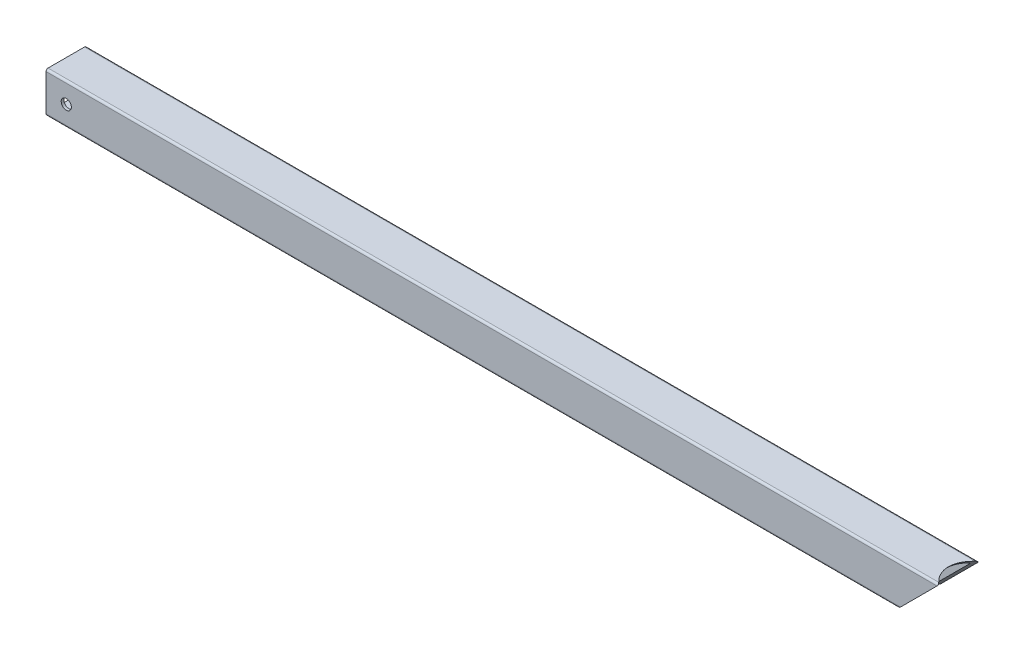
ISO-10303-21;
HEADER;
FILE_DESCRIPTION(('STEP AP214'),'2;1');
FILE_NAME('part.step','',(''),(''),'','','');
FILE_SCHEMA(('AUTOMOTIVE_DESIGN { 1 0 10303 214 1 1 1 1 }'));
ENDSEC;
DATA;
#1=APPLICATION_CONTEXT('core data for automotive mechanical design processes');
#2=APPLICATION_PROTOCOL_DEFINITION('international standard','automotive_design',2000,#1);
#3=PRODUCT_CONTEXT('',#1,'mechanical');
#4=PRODUCT('Part','Part','',(#3));
#5=PRODUCT_RELATED_PRODUCT_CATEGORY('part','',(#4));
#6=PRODUCT_DEFINITION_FORMATION('','',#4);
#7=PRODUCT_DEFINITION_CONTEXT('part definition',#1,'design');
#8=PRODUCT_DEFINITION('design','',#6,#7);
#9=PRODUCT_DEFINITION_SHAPE('','',#8);
#10=(LENGTH_UNIT() NAMED_UNIT(*) SI_UNIT(.MILLI.,.METRE.));
#11=(NAMED_UNIT(*) PLANE_ANGLE_UNIT() SI_UNIT($,.RADIAN.));
#12=(NAMED_UNIT(*) SI_UNIT($,.STERADIAN.) SOLID_ANGLE_UNIT());
#13=UNCERTAINTY_MEASURE_WITH_UNIT(LENGTH_MEASURE(1.E-05),#10,'distance_accuracy_value','');
#14=(GEOMETRIC_REPRESENTATION_CONTEXT(3) GLOBAL_UNCERTAINTY_ASSIGNED_CONTEXT((#13)) GLOBAL_UNIT_ASSIGNED_CONTEXT((#10,
#11,#12)) REPRESENTATION_CONTEXT('',''));
#15=CARTESIAN_POINT('',(0.,0.,0.));
#16=DIRECTION('',(0.,0.,1.));
#17=DIRECTION('',(1.,0.,0.));
#18=AXIS2_PLACEMENT_3D('',#15,#16,#17);
#19=CARTESIAN_POINT('',(279.4,-11.43,-11.43));
#20=DIRECTION('',(-1.,0.,0.));
#21=DIRECTION('',(0.,0.,1.));
#22=AXIS2_PLACEMENT_3D('',#19,#20,#21);
#23=CYLINDRICAL_SURFACE('',#22,1.27);
#24=DIRECTION('',(-1.,0.,0.));
#25=VECTOR('',#24,1.);
#26=CARTESIAN_POINT('',(279.4,-11.43,-12.7));
#27=LINE('',#26,#25);
#28=CARTESIAN_POINT('',(255.919803674975,-11.43,-12.7));
#29=VERTEX_POINT('',#28);
#30=CARTESIAN_POINT('',(-279.4,-11.43,-12.7));
#31=VERTEX_POINT('',#30);
#32=EDGE_CURVE('E49',#29,#31,#27,.T.);
#33=ORIENTED_EDGE('',*,*,#32,.F.);
#34=CARTESIAN_POINT('',(255.919803674975,-11.43,-12.7));
#35=CARTESIAN_POINT('',(255.894957543847,-11.4548417258395,-12.6999962194759));
#36=CARTESIAN_POINT('',(255.869664440707,-11.4792176894659,-12.6992714877463));
#37=CARTESIAN_POINT('',(255.818328055955,-11.5270652930461,-12.6965126686545));
#38=CARTESIAN_POINT('',(255.792285160453,-11.5505373843964,-12.6944792440858));
#39=CARTESIAN_POINT('',(255.713344918863,-11.6195565014448,-12.6866268969872));
#40=CARTESIAN_POINT('',(255.659506355722,-11.6638342299887,-12.6790545017476));
#41=CARTESIAN_POINT('',(255.550178828134,-11.7491797873484,-12.6600129649216));
#42=CARTESIAN_POINT('',(255.494692476709,-11.7902523590301,-12.6485497207063));
#43=CARTESIAN_POINT('',(255.382431099538,-11.8695425997091,-12.6222443449281));
#44=CARTESIAN_POINT('',(255.325654927251,-11.9077575878537,-12.6073990920606));
#45=CARTESIAN_POINT('',(255.175383750814,-12.0045811082829,-12.564489227567));
#46=CARTESIAN_POINT('',(255.081157210331,-12.060976282312,-12.5339676130855));
#47=CARTESIAN_POINT('',(254.891487526311,-12.1671615714709,-12.4660788379171));
#48=CARTESIAN_POINT('',(254.796044185256,-12.2169505989048,-12.4287105523377));
#49=CARTESIAN_POINT('',(254.604429632076,-12.3102786709045,-12.347521843794));
#50=CARTESIAN_POINT('',(254.508257078328,-12.3537977433952,-12.3036816658039));
#51=CARTESIAN_POINT('',(254.316193005717,-12.4342949750355,-12.2098171908621));
#52=CARTESIAN_POINT('',(254.22030146175,-12.4712737371003,-12.1597934646606));
#53=CARTESIAN_POINT('',(254.04211214204,-12.5338171415608,-12.0604469337267));
#54=CARTESIAN_POINT('',(253.959685207277,-12.5602433296724,-12.0118972387238));
#55=CARTESIAN_POINT('',(253.796306888049,-12.6072003476257,-11.9098483388045));
#56=CARTESIAN_POINT('',(253.715353963868,-12.627737704168,-11.8563547010172));
#57=CARTESIAN_POINT('',(253.595855353771,-12.653367463873,-11.7722322717811));
#58=CARTESIAN_POINT('',(253.556432620308,-12.6610362824116,-11.7436146065397));
#59=CARTESIAN_POINT('',(253.47831687986,-12.6745018760352,-11.6849896726999));
#60=CARTESIAN_POINT('',(253.439623679518,-12.6802991539137,-11.6549827798017));
#61=CARTESIAN_POINT('',(253.363019114384,-12.6898312459334,-11.5934054292642));
#62=CARTESIAN_POINT('',(253.325110723037,-12.6935592475362,-11.5618301755331));
#63=CARTESIAN_POINT('',(253.250442758106,-12.6986381948937,-11.4971072604059));
#64=CARTESIAN_POINT('',(253.213684220514,-12.6999870544288,-11.4639582451375));
#65=CARTESIAN_POINT('',(253.177652126478,-12.7,-11.4299999999999));
#66=B_SPLINE_CURVE_WITH_KNOTS('',3,(#34,#35,#36,#37,#38,#39,#40,#41,#42,#43,#44,#45,#46,#47,#48,
#49,#50,#51,#52,#53,#54,#55,#56,#57,#58,#59,#60,#61,#62,#63,#64,#65),.UNSPECIFIED.,.F.,.F.,(4,2,
2,2,2,2,2,2,2,2,2,2,2,2,2,4),(0.,0.105369631536978,0.210685940076655,0.420774442968652,
0.630545925644212,0.840511799428038,1.18194827595703,1.5234409000998,1.86599832860088,
2.20852416213175,2.50600075065606,2.80314635462638,2.95104139317471,3.09889666626283,
3.24723586902615,3.39570508276573),.UNSPECIFIED.);
#67=CARTESIAN_POINT('',(253.177652126478,-12.7,-11.43));
#68=VERTEX_POINT('',#67);
#69=EDGE_CURVE('E217',#29,#68,#66,.T.);
#70=ORIENTED_EDGE('',*,*,#69,.T.);
#71=DIRECTION('',(-1.,0.,0.));
#72=VECTOR('',#71,1.);
#73=CARTESIAN_POINT('',(279.4,-12.7,-11.43));
#74=LINE('',#73,#72);
#75=CARTESIAN_POINT('',(-279.4,-12.7,-11.43));
#76=VERTEX_POINT('',#75);
#77=EDGE_CURVE('E188',#68,#76,#74,.T.);
#78=ORIENTED_EDGE('',*,*,#77,.T.);
#79=CARTESIAN_POINT('',(-279.4,-11.43,-11.43));
#80=DIRECTION('',(1.,0.,0.));
#81=DIRECTION('',(0.,0.,-1.));
#82=AXIS2_PLACEMENT_3D('',#79,#80,#81);
#83=CIRCLE('',#82,1.27);
#84=EDGE_CURVE('E247',#76,#31,#83,.T.);
#85=ORIENTED_EDGE('',*,*,#84,.T.);
#86=EDGE_LOOP('',(#33,#70,#78,#85));
#87=FACE_BOUND('',#86,.T.);
#88=ADVANCED_FACE('F41',(#87),#23,.T.);
#89=CARTESIAN_POINT('',(279.4,-11.43,-12.7));
#90=DIRECTION('',(0.,0.,1.));
#91=DIRECTION('',(1.,0.,0.));
#92=AXIS2_PLACEMENT_3D('',#89,#90,#91);
#93=PLANE('',#92);
#94=CARTESIAN_POINT('',(-266.7,0.,-12.7));
#95=DIRECTION('',(0.,0.,1.));
#96=DIRECTION('',(1.,0.,0.));
#97=AXIS2_PLACEMENT_3D('',#94,#95,#96);
#98=CIRCLE('',#97,3.17500000000009);
#99=CARTESIAN_POINT('',(-263.525,0.,-12.7));
#100=VERTEX_POINT('',#99);
#101=EDGE_CURVE('E205',#100,#100,#98,.T.);
#102=ORIENTED_EDGE('',*,*,#101,.T.);
#103=EDGE_LOOP('',(#102));
#104=FACE_BOUND('',#103,.T.);
#105=DIRECTION('',(-1.,0.,0.));
#106=VECTOR('',#105,1.);
#107=CARTESIAN_POINT('',(279.4,11.43,-12.7));
#108=LINE('',#107,#106);
#109=CARTESIAN_POINT('',(278.779803674975,11.43,-12.7));
#110=VERTEX_POINT('',#109);
#111=CARTESIAN_POINT('',(-279.4,11.43,-12.7));
#112=VERTEX_POINT('',#111);
#113=EDGE_CURVE('E200',#110,#112,#108,.T.);
#114=ORIENTED_EDGE('',*,*,#113,.F.);
#115=DIRECTION('',(0.707106781186546,0.707106781186549,0.));
#116=VECTOR('',#115,1.);
#117=CARTESIAN_POINT('',(-12.3750981625116,-279.724901837487,-12.7));
#118=LINE('',#117,#116);
#119=EDGE_CURVE('E284',#110,#29,#118,.F.);
#120=ORIENTED_EDGE('',*,*,#119,.T.);
#121=ORIENTED_EDGE('',*,*,#32,.T.);
#122=DIRECTION('',(0.,1.,0.));
#123=VECTOR('',#122,1.);
#124=CARTESIAN_POINT('',(-279.4,-11.43,-12.7));
#125=LINE('',#124,#123);
#126=EDGE_CURVE('E250',#31,#112,#125,.T.);
#127=ORIENTED_EDGE('',*,*,#126,.T.);
#128=EDGE_LOOP('',(#114,#120,#121,#127));
#129=FACE_BOUND('',#128,.T.);
#130=ADVANCED_FACE('F370',(#104,#129),#93,.F.);
#131=CARTESIAN_POINT('',(279.4,11.43,-11.43));
#132=DIRECTION('',(-1.,0.,0.));
#133=DIRECTION('',(0.,0.,1.));
#134=AXIS2_PLACEMENT_3D('',#131,#132,#133);
#135=CYLINDRICAL_SURFACE('',#134,1.27);
#136=DIRECTION('',(-1.,0.,0.));
#137=VECTOR('',#136,1.);
#138=CARTESIAN_POINT('',(279.4,12.7,-11.43));
#139=LINE('',#138,#137);
#140=CARTESIAN_POINT('',(278.577652126478,12.7,-11.43));
#141=VERTEX_POINT('',#140);
#142=CARTESIAN_POINT('',(-279.4,12.7,-11.43));
#143=VERTEX_POINT('',#142);
#144=EDGE_CURVE('E198',#141,#143,#139,.T.);
#145=ORIENTED_EDGE('',*,*,#144,.F.);
#146=CARTESIAN_POINT('',(278.577652126478,12.7,-11.43));
#147=CARTESIAN_POINT('',(278.616420180411,12.6999846321577,-11.4665654233653));
#148=CARTESIAN_POINT('',(278.654625926407,12.6984191591043,-11.5037878516088));
#149=CARTESIAN_POINT('',(278.729638826816,12.6917344998643,-11.5796458047302));
#150=CARTESIAN_POINT('',(278.766438577498,12.6865986732247,-11.6182871406798));
#151=CARTESIAN_POINT('',(278.838580906175,12.6721942762635,-11.6973817501484));
#152=CARTESIAN_POINT('',(278.873889616776,12.6628592030363,-11.7378543611719));
#153=CARTESIAN_POINT('',(278.941604926433,12.6394677261573,-11.8197409236704));
#154=CARTESIAN_POINT('',(278.974017473802,12.6254212950463,-11.8611527159754));
#155=CARTESIAN_POINT('',(279.03377304588,12.5926018118235,-11.9429502866958));
#156=CARTESIAN_POINT('',(279.061269038032,12.5740451968597,-11.9833089070582));
#157=CARTESIAN_POINT('',(279.111432017148,12.5313905698115,-12.0639645466447));
#158=CARTESIAN_POINT('',(279.134114216106,12.5073105297732,-12.104261347995));
#159=CARTESIAN_POINT('',(279.173455377153,12.4527270250248,-12.184529268501));
#160=CARTESIAN_POINT('',(279.190023245852,12.4221363520972,-12.2244874185047));
#161=CARTESIAN_POINT('',(279.214788932091,12.3548858739465,-12.3018336315258));
#162=CARTESIAN_POINT('',(279.223001377331,12.3182368063112,-12.3392260788423));
#163=CARTESIAN_POINT('',(279.229276109864,12.2457051248077,-12.4044505337627));
#164=CARTESIAN_POINT('',(279.228630875635,12.2104735423866,-12.4328836956778));
#165=CARTESIAN_POINT('',(279.220194234608,12.1377441190686,-12.4854671472502));
#166=CARTESIAN_POINT('',(279.212401993488,12.1002460140613,-12.509616936485));
#167=CARTESIAN_POINT('',(279.191521733575,12.0284294049004,-12.5508562368796));
#168=CARTESIAN_POINT('',(279.17907436298,11.9941895678329,-12.5684204467489));
#169=CARTESIAN_POINT('',(279.149807494104,11.92588675925,-12.5997905881081));
#170=CARTESIAN_POINT('',(279.132986745302,11.8918238411688,-12.6135954423342));
#171=CARTESIAN_POINT('',(279.084498426514,11.8039519642779,-12.6450612503211));
#172=CARTESIAN_POINT('',(279.050018701105,11.7507164284584,-12.6599712047168));
#173=CARTESIAN_POINT('',(278.974765470416,11.6471821398172,-12.6824198236611));
#174=CARTESIAN_POINT('',(278.933973248081,11.5968927546258,-12.6899360611251));
#175=CARTESIAN_POINT('',(278.873155752986,11.5279268002356,-12.6963825552937));
#176=CARTESIAN_POINT('',(278.854860667167,11.5078850348342,-12.6977639273686));
#177=CARTESIAN_POINT('',(278.817733702223,11.4684747706071,-12.6995693992476));
#178=CARTESIAN_POINT('',(278.798905473958,11.4491030872709,-12.6999989064917));
#179=CARTESIAN_POINT('',(278.779803674975,11.4300000000002,-12.7000000000002));
#180=B_SPLINE_CURVE_WITH_KNOTS('',3,(#146,#147,#148,#149,#150,#151,#152,#153,#154,#155,#156,
#157,#158,#159,#160,#161,#162,#163,#164,#165,#166,#167,#168,#169,#170,#171,#172,#173,#174,#175,
#176,#177,#178,#179),.UNSPECIFIED.,.F.,.F.,(4,2,2,2,2,2,2,2,2,2,2,2,2,2,2,2,4),(0.,
0.159908153118587,0.320566635718767,0.483864263693132,0.646818397947911,0.803118211504047,
0.958916497266179,1.11695023554792,1.27470682827218,1.40972318443091,1.5447553040504,
1.66563472843038,1.78654875510036,1.98090693195935,2.17585284687349,2.25734573523925,
2.33837447172254),.UNSPECIFIED.);
#181=EDGE_CURVE('E285',#141,#110,#180,.T.);
#182=ORIENTED_EDGE('',*,*,#181,.T.);
#183=ORIENTED_EDGE('',*,*,#113,.T.);
#184=CARTESIAN_POINT('',(-279.4,11.43,-11.43));
#185=DIRECTION('',(1.,0.,0.));
#186=DIRECTION('',(0.,0.,-1.));
#187=AXIS2_PLACEMENT_3D('',#184,#185,#186);
#188=CIRCLE('',#187,1.27);
#189=EDGE_CURVE('E253',#112,#143,#188,.T.);
#190=ORIENTED_EDGE('',*,*,#189,.T.);
#191=EDGE_LOOP('',(#145,#182,#183,#190));
#192=FACE_BOUND('',#191,.T.);
#193=ADVANCED_FACE('F298',(#192),#135,.T.);
#194=CARTESIAN_POINT('',(279.4,12.7,-11.43));
#195=DIRECTION('',(0.,-1.,0.));
#196=DIRECTION('',(0.,0.,-1.));
#197=AXIS2_PLACEMENT_3D('',#194,#195,#196);
#198=PLANE('',#197);
#199=DIRECTION('',(-1.,0.,0.));
#200=VECTOR('',#199,1.);
#201=CARTESIAN_POINT('',(279.4,12.7,11.43));
#202=LINE('',#201,#200);
#203=CARTESIAN_POINT('',(278.577652126478,12.7,11.43));
#204=VERTEX_POINT('',#203);
#205=CARTESIAN_POINT('',(-279.4,12.7,11.43));
#206=VERTEX_POINT('',#205);
#207=EDGE_CURVE('E196',#204,#206,#202,.T.);
#208=ORIENTED_EDGE('',*,*,#207,.F.);
#209=CARTESIAN_POINT('',(300.130266817044,12.7,0.));
#210=DIRECTION('',(0.,-1.,0.));
#211=DIRECTION('',(1.,0.,0.));
#212=AXIS2_PLACEMENT_3D('',#209,#210,#211);
#213=ELLIPSE('',#212,26.9407683632074,19.05);
#214=EDGE_CURVE('E289',#204,#141,#213,.T.);
#215=ORIENTED_EDGE('',*,*,#214,.T.);
#216=ORIENTED_EDGE('',*,*,#144,.T.);
#217=DIRECTION('',(0.,0.,1.));
#218=VECTOR('',#217,1.);
#219=CARTESIAN_POINT('',(-279.4,12.7,-11.43));
#220=LINE('',#219,#218);
#221=EDGE_CURVE('E256',#143,#206,#220,.T.);
#222=ORIENTED_EDGE('',*,*,#221,.T.);
#223=EDGE_LOOP('',(#208,#215,#216,#222));
#224=FACE_BOUND('',#223,.T.);
#225=ADVANCED_FACE('F363',(#224),#198,.F.);
#226=CARTESIAN_POINT('',(279.4,11.43,11.43));
#227=DIRECTION('',(-1.,0.,0.));
#228=DIRECTION('',(0.,0.,1.));
#229=AXIS2_PLACEMENT_3D('',#226,#227,#228);
#230=CYLINDRICAL_SURFACE('',#229,1.27);
#231=DIRECTION('',(-1.,0.,0.));
#232=VECTOR('',#231,1.);
#233=CARTESIAN_POINT('',(279.4,11.43,12.7));
#234=LINE('',#233,#232);
#235=CARTESIAN_POINT('',(278.779803674975,11.43,12.7));
#236=VERTEX_POINT('',#235);
#237=CARTESIAN_POINT('',(-279.4,11.43,12.7));
#238=VERTEX_POINT('',#237);
#239=EDGE_CURVE('E194',#236,#238,#234,.T.);
#240=ORIENTED_EDGE('',*,*,#239,.F.);
#241=CARTESIAN_POINT('',(278.779803674975,11.43,12.7));
#242=CARTESIAN_POINT('',(278.804444362603,11.4546480084071,12.6999939638767));
#243=CARTESIAN_POINT('',(278.82863190141,11.4797362083523,12.6992823272284));
#244=CARTESIAN_POINT('',(278.875954336379,11.5308965841626,12.6962471606912));
#245=CARTESIAN_POINT('',(278.899086671782,11.5569708992045,12.6939199110048));
#246=CARTESIAN_POINT('',(278.967124564795,11.637379382943,12.68412836582));
#247=CARTESIAN_POINT('',(279.009985879419,11.6932282083046,12.6738428451918));
#248=CARTESIAN_POINT('',(279.075773257981,11.791160556714,12.6482804993879));
#249=CARTESIAN_POINT('',(279.100842759709,11.8324180649487,12.6353864613769));
#250=CARTESIAN_POINT('',(279.14527882576,11.915790984173,12.6042531765812));
#251=CARTESIAN_POINT('',(279.16467372316,11.9579009701733,12.5860414253625));
#252=CARTESIAN_POINT('',(279.193717108424,12.0349751465982,12.5473376800479));
#253=CARTESIAN_POINT('',(279.204448002064,12.069967322891,12.5277234064691));
#254=CARTESIAN_POINT('',(279.220193951898,12.1388355944765,12.4845615866853));
#255=CARTESIAN_POINT('',(279.225208762388,12.1727116417321,12.461013871453));
#256=CARTESIAN_POINT('',(279.229166370706,12.2382563744188,12.4104776686741));
#257=CARTESIAN_POINT('',(279.228100327614,12.2699217781182,12.3834842271353));
#258=CARTESIAN_POINT('',(279.220099417013,12.3300596592717,12.3269385893725));
#259=CARTESIAN_POINT('',(279.213161891738,12.3585306841579,12.2973852398281));
#260=CARTESIAN_POINT('',(279.194226190004,12.4113988157248,12.2370607875753));
#261=CARTESIAN_POINT('',(279.182292904979,12.4358427502721,12.2063097301285));
#262=CARTESIAN_POINT('',(279.154231598695,12.480971855613,12.1440303912843));
#263=CARTESIAN_POINT('',(279.138103639397,12.5016570819201,12.1125021213736));
#264=CARTESIAN_POINT('',(279.091002474962,12.551580652597,12.0288528074961));
#265=CARTESIAN_POINT('',(279.057152484468,12.5777644708162,11.9765280364669));
#266=CARTESIAN_POINT('',(278.983117882197,12.6217402367498,11.8725715311363));
#267=CARTESIAN_POINT('',(278.94289726187,12.6394820356141,11.8209456658597));
#268=CARTESIAN_POINT('',(278.850862337502,12.6701795889949,11.7105008041841));
#269=CARTESIAN_POINT('',(278.798245653844,12.6817784169615,11.651980502399));
#270=CARTESIAN_POINT('',(278.716869698192,12.6929423893217,11.5666796992762));
#271=CARTESIAN_POINT('',(278.689543380427,12.6956271771959,11.5388530691607));
#272=CARTESIAN_POINT('',(278.634136982983,12.6991527944397,11.4839059658847));
#273=CARTESIAN_POINT('',(278.606057849447,12.6999958378029,11.4567846836284));
#274=CARTESIAN_POINT('',(278.577652126478,12.7,11.43));
#275=B_SPLINE_CURVE_WITH_KNOTS('',3,(#241,#242,#243,#244,#245,#246,#247,#248,#249,#250,#251,
#252,#253,#254,#255,#256,#257,#258,#259,#260,#261,#262,#263,#264,#265,#266,#267,#268,#269,#270,
#271,#272,#273,#274),.UNSPECIFIED.,.F.,.F.,(4,2,2,2,2,2,2,2,2,2,2,2,2,2,2,2,4),(0.,
0.104517300331745,0.209276043519903,0.421650486139639,0.571081911823154,0.719753976005541,
0.843793698348452,0.96783875228178,1.09206420053156,1.21634591035024,1.33906105752559,
1.46177439213892,1.66340528347579,1.86621943192861,2.10408229523501,2.22131969384218,
2.33841608157691),.UNSPECIFIED.);
#276=EDGE_CURVE('E350',#236,#204,#275,.T.);
#277=ORIENTED_EDGE('',*,*,#276,.T.);
#278=ORIENTED_EDGE('',*,*,#207,.T.);
#279=CARTESIAN_POINT('',(-279.4,11.43,11.43));
#280=DIRECTION('',(1.,0.,0.));
#281=DIRECTION('',(0.,0.,-1.));
#282=AXIS2_PLACEMENT_3D('',#279,#280,#281);
#283=CIRCLE('',#282,1.27);
#284=EDGE_CURVE('E259',#206,#238,#283,.T.);
#285=ORIENTED_EDGE('',*,*,#284,.T.);
#286=EDGE_LOOP('',(#240,#277,#278,#285));
#287=FACE_BOUND('',#286,.T.);
#288=ADVANCED_FACE('F358',(#287),#230,.T.);
#289=CARTESIAN_POINT('',(279.4,-11.43,12.7));
#290=DIRECTION('',(0.,0.,-1.));
#291=DIRECTION('',(-1.,0.,0.));
#292=AXIS2_PLACEMENT_3D('',#289,#290,#291);
#293=PLANE('',#292);
#294=CARTESIAN_POINT('',(-266.7,0.,12.7));
#295=DIRECTION('',(0.,0.,1.));
#296=DIRECTION('',(1.,0.,0.));
#297=AXIS2_PLACEMENT_3D('',#294,#295,#296);
#298=CIRCLE('',#297,3.17500000000009);
#299=CARTESIAN_POINT('',(-263.525,0.,12.7));
#300=VERTEX_POINT('',#299);
#301=EDGE_CURVE('E212',#300,#300,#298,.T.);
#302=ORIENTED_EDGE('',*,*,#301,.F.);
#303=EDGE_LOOP('',(#302));
#304=FACE_BOUND('',#303,.T.);
#305=DIRECTION('',(-1.,0.,0.));
#306=VECTOR('',#305,1.);
#307=CARTESIAN_POINT('',(279.4,-11.43,12.7));
#308=LINE('',#307,#306);
#309=CARTESIAN_POINT('',(255.919803674975,-11.43,12.7));
#310=VERTEX_POINT('',#309);
#311=CARTESIAN_POINT('',(-279.4,-11.43,12.7));
#312=VERTEX_POINT('',#311);
#313=EDGE_CURVE('E192',#310,#312,#308,.T.);
#314=ORIENTED_EDGE('',*,*,#313,.F.);
#315=DIRECTION('',(0.707106781186546,0.707106781186549,0.));
#316=VECTOR('',#315,1.);
#317=CARTESIAN_POINT('',(-12.3750981625116,-279.724901837487,12.7));
#318=LINE('',#317,#316);
#319=EDGE_CURVE('E357',#310,#236,#318,.T.);
#320=ORIENTED_EDGE('',*,*,#319,.T.);
#321=ORIENTED_EDGE('',*,*,#239,.T.);
#322=DIRECTION('',(0.,-1.,0.));
#323=VECTOR('',#322,1.);
#324=CARTESIAN_POINT('',(-279.4,-11.43,12.7));
#325=LINE('',#324,#323);
#326=EDGE_CURVE('E262',#238,#312,#325,.T.);
#327=ORIENTED_EDGE('',*,*,#326,.T.);
#328=EDGE_LOOP('',(#314,#320,#321,#327));
#329=FACE_BOUND('',#328,.T.);
#330=ADVANCED_FACE('F362',(#304,#329),#293,.F.);
#331=CARTESIAN_POINT('',(279.4,-11.43,11.43));
#332=DIRECTION('',(-1.,0.,0.));
#333=DIRECTION('',(0.,0.,1.));
#334=AXIS2_PLACEMENT_3D('',#331,#332,#333);
#335=CYLINDRICAL_SURFACE('',#334,1.27);
#336=DIRECTION('',(-1.,0.,0.));
#337=VECTOR('',#336,1.);
#338=CARTESIAN_POINT('',(279.4,-12.7,11.43));
#339=LINE('',#338,#337);
#340=CARTESIAN_POINT('',(253.177652126478,-12.7,11.43));
#341=VERTEX_POINT('',#340);
#342=CARTESIAN_POINT('',(-279.4,-12.7,11.43));
#343=VERTEX_POINT('',#342);
#344=EDGE_CURVE('E190',#341,#343,#339,.T.);
#345=ORIENTED_EDGE('',*,*,#344,.F.);
#346=CARTESIAN_POINT('',(253.177652126478,-12.7,11.43));
#347=CARTESIAN_POINT('',(253.205104793447,-12.6999959154023,11.4558784785728));
#348=CARTESIAN_POINT('',(253.232984285976,-12.6992094063169,11.4812849787559));
#349=CARTESIAN_POINT('',(253.289458175372,-12.6962106257014,11.5311789842798));
#350=CARTESIAN_POINT('',(253.318052236947,-12.6939990112205,11.55566690763));
#351=CARTESIAN_POINT('',(253.404600060034,-12.685447291348,11.6277113453743));
#352=CARTESIAN_POINT('',(253.463450655592,-12.6771889628395,11.6739707137514));
#353=CARTESIAN_POINT('',(253.582882682347,-12.6563396077054,11.7633129359902));
#354=CARTESIAN_POINT('',(253.643466722037,-12.643741698336,11.8063906109524));
#355=CARTESIAN_POINT('',(253.765843595806,-12.6147615654862,11.8895412616229));
#356=CARTESIAN_POINT('',(253.827637426448,-12.5983760906549,11.9296116163904));
#357=CARTESIAN_POINT('',(253.986718501894,-12.55214338598,12.028428424659));
#358=CARTESIAN_POINT('',(254.084582674398,-12.5198846183341,12.0851289957576));
#359=CARTESIAN_POINT('',(254.2812280029,-12.4480968681711,12.1919151290621));
#360=CARTESIAN_POINT('',(254.38000929725,-12.4085667712457,12.2419996752675));
#361=CARTESIAN_POINT('',(254.577740360337,-12.3226222000374,12.335630038794));
#362=CARTESIAN_POINT('',(254.676690186553,-12.2762044882759,12.3791727616981));
#363=CARTESIAN_POINT('',(254.873918477183,-12.1765335846637,12.4594089097371));
#364=CARTESIAN_POINT('',(254.972197095657,-12.1232820209887,12.4961039612463));
#365=CARTESIAN_POINT('',(255.144468623298,-12.0228324849519,12.5542715388771));
#366=CARTESIAN_POINT('',(255.218796263503,-11.9771048660253,12.5772997806269));
#367=CARTESIAN_POINT('',(255.365854616045,-11.8811698067722,12.6183045676409));
#368=CARTESIAN_POINT('',(255.438587203529,-11.8309680218012,12.6362873742907));
#369=CARTESIAN_POINT('',(255.54585132871,-11.7519933064939,12.658806764282));
#370=CARTESIAN_POINT('',(255.581287073258,-11.725067368271,12.6655690260273));
#371=CARTESIAN_POINT('',(255.651406616922,-11.6699176131027,12.6774515276572));
#372=CARTESIAN_POINT('',(255.686090623327,-11.6416941608163,12.6825722257072));
#373=CARTESIAN_POINT('',(255.754654634073,-11.5837683722331,12.6909983744161));
#374=CARTESIAN_POINT('',(255.788531310221,-11.5540610967744,12.6942972514603));
#375=CARTESIAN_POINT('',(255.855117990631,-11.4931594337706,12.6987934427146));
#376=CARTESIAN_POINT('',(255.887826891666,-11.461963701811,12.6999888186119));
#377=CARTESIAN_POINT('',(255.919803674975,-11.43,12.7));
#378=B_SPLINE_CURVE_WITH_KNOTS('',3,(#346,#347,#348,#349,#350,#351,#352,#353,#354,#355,#356,
#357,#358,#359,#360,#361,#362,#363,#364,#365,#366,#367,#368,#369,#370,#371,#372,#373,#374,#375,
#376,#377),.UNSPECIFIED.,.F.,.F.,(4,2,2,2,2,2,2,2,2,2,2,2,2,2,2,4),(0.,0.113147336203438,
0.226242542779318,0.451897166197312,0.677911347164117,0.904120270247521,1.25647276878089,
1.60887931413885,1.96145203373239,2.31394090773599,2.5844905605703,2.85470296099514,
2.98970617826235,3.12467168283961,3.26012104898458,3.3956951624006),.UNSPECIFIED.);
#379=EDGE_CURVE('E56',#341,#310,#378,.T.);
#380=ORIENTED_EDGE('',*,*,#379,.T.);
#381=ORIENTED_EDGE('',*,*,#313,.T.);
#382=CARTESIAN_POINT('',(-279.4,-11.43,11.43));
#383=DIRECTION('',(1.,0.,0.));
#384=DIRECTION('',(0.,0.,-1.));
#385=AXIS2_PLACEMENT_3D('',#382,#383,#384);
#386=CIRCLE('',#385,1.27);
#387=EDGE_CURVE('E265',#312,#343,#386,.T.);
#388=ORIENTED_EDGE('',*,*,#387,.T.);
#389=EDGE_LOOP('',(#345,#380,#381,#388));
#390=FACE_BOUND('',#389,.T.);
#391=ADVANCED_FACE('F427',(#390),#335,.T.);
#392=CARTESIAN_POINT('',(279.4,-12.7,-11.43));
#393=DIRECTION('',(0.,1.,0.));
#394=DIRECTION('',(0.,0.,1.));
#395=AXIS2_PLACEMENT_3D('',#392,#393,#394);
#396=PLANE('',#395);
#397=ORIENTED_EDGE('',*,*,#77,.F.);
#398=CARTESIAN_POINT('',(274.730266817044,-12.7,0.));
#399=DIRECTION('',(0.,1.,0.));
#400=DIRECTION('',(1.,0.,0.));
#401=AXIS2_PLACEMENT_3D('',#398,#399,#400);
#402=ELLIPSE('',#401,26.9407683632074,19.05);
#403=EDGE_CURVE('E388',#68,#341,#402,.T.);
#404=ORIENTED_EDGE('',*,*,#403,.T.);
#405=ORIENTED_EDGE('',*,*,#344,.T.);
#406=DIRECTION('',(0.,0.,-1.));
#407=VECTOR('',#406,1.);
#408=CARTESIAN_POINT('',(-279.4,-12.7,-11.43));
#409=LINE('',#408,#407);
#410=EDGE_CURVE('E175',#343,#76,#409,.T.);
#411=ORIENTED_EDGE('',*,*,#410,.T.);
#412=EDGE_LOOP('',(#397,#404,#405,#411));
#413=FACE_BOUND('',#412,.T.);
#414=ADVANCED_FACE('F271',(#413),#396,.F.);
#415=CARTESIAN_POINT('',(279.4,9.9441,-9.9441));
#416=DIRECTION('',(-1.,0.,0.));
#417=DIRECTION('',(0.,0.,1.));
#418=AXIS2_PLACEMENT_3D('',#415,#416,#417);
#419=CYLINDRICAL_SURFACE('',#418,1.1049);
#420=CARTESIAN_POINT('',(275.500260085246,11.049,-9.94409999999999));
#421=CARTESIAN_POINT('',(275.543594479885,11.0489623589223,-9.99422514774841));
#422=CARTESIAN_POINT('',(275.585546369194,11.0455770040651,-10.0460755079452));
#423=CARTESIAN_POINT('',(275.664954730916,11.0304492062268,-10.1529842978263));
#424=CARTESIAN_POINT('',(275.702343539001,11.0185955437629,-10.2080763706975));
#425=CARTESIAN_POINT('',(275.7598178817,10.989707662969,-10.3035612229134));
#426=CARTESIAN_POINT('',(275.781771604154,10.9751873183332,-10.3435625746947));
#427=CARTESIAN_POINT('',(275.82058382414,10.940551224373,-10.4234454659565));
#428=CARTESIAN_POINT('',(275.837465243982,10.9204614612397,-10.4633267127367));
#429=CARTESIAN_POINT('',(275.862579703873,10.8782632655077,-10.5353547797238));
#430=CARTESIAN_POINT('',(275.871785531751,10.8570502492923,-10.5676822698669));
#431=CARTESIAN_POINT('',(275.885043525412,10.810730855488,-10.6305967859964));
#432=CARTESIAN_POINT('',(275.889096047389,10.7856247471233,-10.6611839321353));
#433=CARTESIAN_POINT('',(275.891603280948,10.7320492302237,-10.7196749724073));
#434=CARTESIAN_POINT('',(275.890042930216,10.7035709705126,-10.7475714399902));
#435=CARTESIAN_POINT('',(275.881337211809,10.6442632347601,-10.799750022628));
#436=CARTESIAN_POINT('',(275.874190747729,10.6134332982192,-10.8240314270286));
#437=CARTESIAN_POINT('',(275.855213969245,10.5517119280862,-10.8676731932718));
#438=CARTESIAN_POINT('',(275.843574631291,10.5208685855693,-10.887187056416));
#439=CARTESIAN_POINT('',(275.816325065814,10.4588132309385,-10.9224404039863));
#440=CARTESIAN_POINT('',(275.800713688831,10.4276011146035,-10.9381787932702));
#441=CARTESIAN_POINT('',(275.756470058783,10.3477458926401,-10.974017447504));
#442=CARTESIAN_POINT('',(275.725474016015,10.2992543860046,-10.9915307131026));
#443=CARTESIAN_POINT('',(275.657867867722,10.204003675147,-11.0191489032265));
#444=CARTESIAN_POINT('',(275.621236887604,10.1572517494924,-11.0292254389559));
#445=CARTESIAN_POINT('',(275.558157161467,10.0826692067131,-11.0406688572015));
#446=CARTESIAN_POINT('',(275.532836709711,10.0541284289429,-11.0438693661508));
#447=CARTESIAN_POINT('',(275.481153868327,9.99826532721241,-11.048022211529));
#448=CARTESIAN_POINT('',(275.454801696745,9.9709349456497,-11.0489927249722));
#449=CARTESIAN_POINT('',(275.427973081398,9.94409999999998,-11.049));
#450=B_SPLINE_CURVE_WITH_KNOTS('',3,(#420,#421,#422,#423,#424,#425,#426,#427,#428,#429,#430,
#431,#432,#433,#434,#435,#436,#437,#438,#439,#440,#441,#442,#443,#444,#445,#446,#447,#448,#449),
.UNSPECIFIED.,.F.,.F.,(4,2,2,2,2,2,2,2,2,2,2,2,2,2,4),(0.,0.199310004043447,0.401286961710298,
0.544445962972712,0.686947930205955,0.80568448963169,0.924412841571848,1.04346004205384,
1.1625306141958,1.27701570977763,1.3915339737156,1.57098803191096,1.7511236397492,
1.86589617927448,1.9797298210626),.UNSPECIFIED.);
#451=CARTESIAN_POINT('',(275.500260085246,11.049,-9.94409999999999));
#452=VERTEX_POINT('',#451);
#453=CARTESIAN_POINT('',(275.427973081398,9.94409999999995,-11.049));
#454=VERTEX_POINT('',#453);
#455=EDGE_CURVE('E63',#452,#454,#450,.T.);
#456=ORIENTED_EDGE('',*,*,#455,.F.);
#457=DIRECTION('',(-1.,0.,0.));
#458=VECTOR('',#457,1.);
#459=CARTESIAN_POINT('',(279.4,11.049,-9.94409999999999));
#460=LINE('',#459,#458);
#461=CARTESIAN_POINT('',(-279.4,11.049,-9.94409999999999));
#462=VERTEX_POINT('',#461);
#463=EDGE_CURVE('E186',#452,#462,#460,.T.);
#464=ORIENTED_EDGE('',*,*,#463,.T.);
#465=CARTESIAN_POINT('',(-279.4,9.9441,-9.9441));
#466=DIRECTION('',(1.,0.,0.));
#467=DIRECTION('',(0.,0.,-1.));
#468=AXIS2_PLACEMENT_3D('',#465,#466,#467);
#469=CIRCLE('',#468,1.1049);
#470=CARTESIAN_POINT('',(-279.4,9.9441,-11.049));
#471=VERTEX_POINT('',#470);
#472=EDGE_CURVE('E209',#471,#462,#469,.T.);
#473=ORIENTED_EDGE('',*,*,#472,.F.);
#474=DIRECTION('',(-1.,0.,0.));
#475=VECTOR('',#474,1.);
#476=CARTESIAN_POINT('',(279.4,9.9441,-11.049));
#477=LINE('',#476,#475);
#478=EDGE_CURVE('E171',#454,#471,#477,.T.);
#479=ORIENTED_EDGE('',*,*,#478,.F.);
#480=EDGE_LOOP('',(#456,#464,#473,#479));
#481=FACE_BOUND('',#480,.T.);
#482=ADVANCED_FACE('F420',(#481),#419,.F.);
#483=CARTESIAN_POINT('',(279.4,11.049,-9.94409999999999));
#484=DIRECTION('',(0.,-1.,0.));
#485=DIRECTION('',(0.,0.,-1.));
#486=AXIS2_PLACEMENT_3D('',#483,#484,#485);
#487=PLANE('',#486);
#488=CARTESIAN_POINT('',(298.479266817044,11.049,0.));
#489=DIRECTION('',(0.,-1.,0.));
#490=DIRECTION('',(1.,0.,0.));
#491=AXIS2_PLACEMENT_3D('',#488,#489,#490);
#492=ELLIPSE('',#491,26.9407683632074,19.05);
#493=CARTESIAN_POINT('',(275.500260085246,11.049,9.94409999999999));
#494=VERTEX_POINT('',#493);
#495=EDGE_CURVE('E390',#494,#452,#492,.T.);
#496=ORIENTED_EDGE('',*,*,#495,.F.);
#497=DIRECTION('',(-1.,0.,0.));
#498=VECTOR('',#497,1.);
#499=CARTESIAN_POINT('',(279.4,11.049,9.94409999999999));
#500=LINE('',#499,#498);
#501=CARTESIAN_POINT('',(-279.4,11.049,9.94409999999999));
#502=VERTEX_POINT('',#501);
#503=EDGE_CURVE('E184',#494,#502,#500,.T.);
#504=ORIENTED_EDGE('',*,*,#503,.T.);
#505=DIRECTION('',(0.,0.,1.));
#506=VECTOR('',#505,1.);
#507=CARTESIAN_POINT('',(-279.4,11.049,-9.94409999999999));
#508=LINE('',#507,#506);
#509=EDGE_CURVE('E229',#462,#502,#508,.T.);
#510=ORIENTED_EDGE('',*,*,#509,.F.);
#511=ORIENTED_EDGE('',*,*,#463,.F.);
#512=EDGE_LOOP('',(#496,#504,#510,#511));
#513=FACE_BOUND('',#512,.T.);
#514=ADVANCED_FACE('F416',(#513),#487,.T.);
#515=CARTESIAN_POINT('',(279.4,9.94409999999999,9.94409999999999));
#516=DIRECTION('',(-1.,0.,0.));
#517=DIRECTION('',(0.,0.,1.));
#518=AXIS2_PLACEMENT_3D('',#515,#516,#517);
#519=CYLINDRICAL_SURFACE('',#518,1.10490000000001);
#520=CARTESIAN_POINT('',(275.427973081398,9.94409999999999,11.049));
#521=CARTESIAN_POINT('',(275.453384411812,9.96951894451295,11.0489920869654));
#522=CARTESIAN_POINT('',(275.478352604581,9.99536330472843,11.0481224961168));
#523=CARTESIAN_POINT('',(275.52726288051,10.0479966325637,11.0444235439698));
#524=CARTESIAN_POINT('',(275.551201995345,10.0747879731736,11.0415888710133));
#525=CARTESIAN_POINT('',(275.621675921743,10.1572333531556,11.0296828166362));
#526=CARTESIAN_POINT('',(275.66618204297,10.214286359411,11.017196379236));
#527=CARTESIAN_POINT('',(275.732386548137,10.3104324196325,10.9872554064251));
#528=CARTESIAN_POINT('',(275.756609805421,10.3488071291456,10.9730788478281));
#529=CARTESIAN_POINT('',(275.800083267114,10.4258292811252,10.9393362157207));
#530=CARTESIAN_POINT('',(275.819356975998,10.4644745042948,10.9197965622913));
#531=CARTESIAN_POINT('',(275.849107424542,10.5349761760424,10.8784787008623));
#532=CARTESIAN_POINT('',(275.860493831522,10.5669387096991,10.8575447633941));
#533=CARTESIAN_POINT('',(275.878091601596,10.6294121289694,10.811654232911));
#534=CARTESIAN_POINT('',(275.884302994671,10.659923022992,10.7866976632021));
#535=CARTESIAN_POINT('',(275.891099298201,10.7184970715995,10.733207002983));
#536=CARTESIAN_POINT('',(275.891668265597,10.7465530684376,10.7046630059496));
#537=CARTESIAN_POINT('',(275.887184223036,10.7992010066032,10.6449508741299));
#538=CARTESIAN_POINT('',(275.882130072334,10.8237922439051,10.6137822080708));
#539=CARTESIAN_POINT('',(275.867247598343,10.8680149021171,10.5512184030666));
#540=CARTESIAN_POINT('',(275.857629738553,10.8878118302169,10.5198883237195));
#541=CARTESIAN_POINT('',(275.834408528421,10.9236353725254,10.4565838107762));
#542=CARTESIAN_POINT('',(275.820803830777,10.9396607088648,10.424609162763));
#543=CARTESIAN_POINT('',(275.782309378468,10.9755508424843,10.3438056478206));
#544=CARTESIAN_POINT('',(275.755245574353,10.9930108668614,10.2949458433706));
#545=CARTESIAN_POINT('',(275.695642320526,11.0205113300132,10.1984166789934));
#546=CARTESIAN_POINT('',(275.663085477543,11.0305276365882,10.1507516709084));
#547=CARTESIAN_POINT('',(275.608389925652,11.0413649364926,10.0766876035161));
#548=CARTESIAN_POINT('',(275.587498600711,11.0442749480736,10.0496324572585));
#549=CARTESIAN_POINT('',(275.544638528102,11.0480893378584,9.99628833126703));
#550=CARTESIAN_POINT('',(275.522670968429,11.0489958787711,9.96999855562361));
#551=CARTESIAN_POINT('',(275.500260085246,11.049,9.94409999999994));
#552=B_SPLINE_CURVE_WITH_KNOTS('',3,(#520,#521,#522,#523,#524,#525,#526,#527,#528,#529,#530,
#531,#532,#533,#534,#535,#536,#537,#538,#539,#540,#541,#542,#543,#544,#545,#546,#547,#548,#549,
#550,#551),.UNSPECIFIED.,.F.,.F.,(4,2,2,2,2,2,2,2,2,2,2,2,2,2,2,4),(0.,0.107776671890256,
0.21584580812039,0.434841700667834,0.577036502921587,0.718543011977464,0.837644584601014,
0.956745467207537,1.07618278194084,1.19564433097765,1.31006476843454,1.42452391754392,
1.59910501396937,1.77424965456499,1.87709268669865,1.97982464736806),.UNSPECIFIED.);
#553=CARTESIAN_POINT('',(275.427973081398,9.94409999999996,11.049));
#554=VERTEX_POINT('',#553);
#555=EDGE_CURVE('E327',#554,#494,#552,.T.);
#556=ORIENTED_EDGE('',*,*,#555,.F.);
#557=DIRECTION('',(-1.,0.,0.));
#558=VECTOR('',#557,1.);
#559=CARTESIAN_POINT('',(279.4,9.94409999999999,11.049));
#560=LINE('',#559,#558);
#561=CARTESIAN_POINT('',(-279.4,9.94409999999999,11.049));
#562=VERTEX_POINT('',#561);
#563=EDGE_CURVE('E182',#554,#562,#560,.T.);
#564=ORIENTED_EDGE('',*,*,#563,.T.);
#565=CARTESIAN_POINT('',(-279.4,9.94409999999999,9.94409999999999));
#566=DIRECTION('',(1.,0.,0.));
#567=DIRECTION('',(0.,0.,-1.));
#568=AXIS2_PLACEMENT_3D('',#565,#566,#567);
#569=CIRCLE('',#568,1.10490000000001);
#570=EDGE_CURVE('E232',#502,#562,#569,.T.);
#571=ORIENTED_EDGE('',*,*,#570,.F.);
#572=ORIENTED_EDGE('',*,*,#503,.F.);
#573=EDGE_LOOP('',(#556,#564,#571,#572));
#574=FACE_BOUND('',#573,.T.);
#575=ADVANCED_FACE('F412',(#574),#519,.F.);
#576=CARTESIAN_POINT('',(279.4,9.94409999999999,11.049));
#577=DIRECTION('',(0.,0.,-1.));
#578=DIRECTION('',(0.,1.,0.));
#579=AXIS2_PLACEMENT_3D('',#576,#577,#578);
#580=PLANE('',#579);
#581=DIRECTION('',(0.707106781186546,0.707106781186549,0.));
#582=VECTOR('',#581,1.);
#583=CARTESIAN_POINT('',(-13.3080634593,-278.791936540699,11.049));
#584=LINE('',#583,#582);
#585=CARTESIAN_POINT('',(255.539773081398,-9.9441,11.049));
#586=VERTEX_POINT('',#585);
#587=EDGE_CURVE('E392',#586,#554,#584,.T.);
#588=ORIENTED_EDGE('',*,*,#587,.F.);
#589=DIRECTION('',(-1.,0.,0.));
#590=VECTOR('',#589,1.);
#591=CARTESIAN_POINT('',(279.4,-9.9441,11.049));
#592=LINE('',#591,#590);
#593=CARTESIAN_POINT('',(-279.4,-9.9441,11.049));
#594=VERTEX_POINT('',#593);
#595=EDGE_CURVE('E180',#586,#594,#592,.T.);
#596=ORIENTED_EDGE('',*,*,#595,.T.);
#597=DIRECTION('',(0.,-1.,0.));
#598=VECTOR('',#597,1.);
#599=CARTESIAN_POINT('',(-279.4,9.94409999999999,11.049));
#600=LINE('',#599,#598);
#601=EDGE_CURVE('E235',#562,#594,#600,.T.);
#602=ORIENTED_EDGE('',*,*,#601,.F.);
#603=ORIENTED_EDGE('',*,*,#563,.F.);
#604=EDGE_LOOP('',(#588,#596,#602,#603));
#605=FACE_BOUND('',#604,.T.);
#606=CARTESIAN_POINT('',(-266.7,0.,11.049));
#607=DIRECTION('',(0.,0.,-1.));
#608=DIRECTION('',(0.,1.,0.));
#609=AXIS2_PLACEMENT_3D('',#606,#607,#608);
#610=CIRCLE('',#609,3.17500000000009);
#611=CARTESIAN_POINT('',(-266.7,3.17500000000009,11.049));
#612=VERTEX_POINT('',#611);
#613=EDGE_CURVE('E204',#612,#612,#610,.T.);
#614=ORIENTED_EDGE('',*,*,#613,.F.);
#615=EDGE_LOOP('',(#614));
#616=FACE_BOUND('',#615,.T.);
#617=ADVANCED_FACE('F409',(#605,#616),#580,.T.);
#618=CARTESIAN_POINT('',(279.4,-9.9441,9.9441));
#619=DIRECTION('',(-1.,0.,0.));
#620=DIRECTION('',(0.,0.,1.));
#621=AXIS2_PLACEMENT_3D('',#618,#619,#620);
#622=CYLINDRICAL_SURFACE('',#621,1.1049);
#623=CARTESIAN_POINT('',(253.402260085246,-11.049,9.94409999999999));
#624=CARTESIAN_POINT('',(253.433069554142,-11.0489808138653,9.97967428788797));
#625=CARTESIAN_POINT('',(253.464934269735,-11.047282524329,10.0142675160222));
#626=CARTESIAN_POINT('',(253.530285270087,-11.0409486625526,10.0814867676457));
#627=CARTESIAN_POINT('',(253.563768381597,-11.0363186388191,10.1141163799511));
#628=CARTESIAN_POINT('',(253.631725507259,-11.0245841319121,10.1772942537703));
#629=CARTESIAN_POINT('',(253.666189968097,-11.0174988719876,10.207856542142));
#630=CARTESIAN_POINT('',(253.736095363751,-11.0011327131899,10.2672653453002));
#631=CARTESIAN_POINT('',(253.771536955043,-10.9918503047759,10.2961106633223));
#632=CARTESIAN_POINT('',(253.868304810939,-10.96412269527,10.3718153030309));
#633=CARTESIAN_POINT('',(253.930334835976,-10.943819868459,10.4171039335868));
#634=CARTESIAN_POINT('',(254.055738184277,-10.8983685213683,10.5031548882839));
#635=CARTESIAN_POINT('',(254.119112028787,-10.8732180890105,10.5439154163373));
#636=CARTESIAN_POINT('',(254.247142785357,-10.8183781871988,10.6213820906484));
#637=CARTESIAN_POINT('',(254.311805883167,-10.7886543599893,10.6580535851296));
#638=CARTESIAN_POINT('',(254.441449931995,-10.7251527713038,10.727015645932));
#639=CARTESIAN_POINT('',(254.506430820043,-10.6913757840396,10.7593070464114));
#640=CARTESIAN_POINT('',(254.638930603754,-10.6184989984827,10.820655471855));
#641=CARTESIAN_POINT('',(254.706446420418,-10.5792397158905,10.8495300842664));
#642=CARTESIAN_POINT('',(254.840952726903,-10.4965540618549,10.9022248679197));
#643=CARTESIAN_POINT('',(254.907942977679,-10.4531259010785,10.9260428545833));
#644=CARTESIAN_POINT('',(255.040323812345,-10.3623852934285,10.9679762060788));
#645=CARTESIAN_POINT('',(255.10572248303,-10.3151033650809,10.9861317516901));
#646=CARTESIAN_POINT('',(255.234641488065,-10.2162631800757,11.016199946162));
#647=CARTESIAN_POINT('',(255.298163999097,-10.1647101660977,11.0281201210712));
#648=CARTESIAN_POINT('',(255.390962417167,-10.0842602584345,11.0404049935212));
#649=CARTESIAN_POINT('',(255.421347030113,-10.0570555631385,11.0435654886148));
#650=CARTESIAN_POINT('',(255.481263137556,-10.0014631337651,11.0478611386839));
#651=CARTESIAN_POINT('',(255.510792957962,-9.97307331333761,11.0489925532054));
#652=CARTESIAN_POINT('',(255.539773081398,-9.94410000000008,11.049));
#653=B_SPLINE_CURVE_WITH_KNOTS('',3,(#623,#624,#625,#626,#627,#628,#629,#630,#631,#632,#633,
#634,#635,#636,#637,#638,#639,#640,#641,#642,#643,#644,#645,#646,#647,#648,#649,#650,#651,#652),
.UNSPECIFIED.,.F.,.F.,(4,2,2,2,2,2,2,2,2,2,2,2,2,2,4),(0.,0.141058917835581,0.281851666747356,
0.421566096957241,0.561376797381897,0.799343522907533,1.03740430426124,1.27734973234319,
1.51724940014249,1.76680152779814,2.01646124928903,2.26430680369591,2.51185251596009,
2.63450361741243,2.7573805852387),.UNSPECIFIED.);
#654=CARTESIAN_POINT('',(253.402260085247,-11.049,9.94409999999999));
#655=VERTEX_POINT('',#654);
#656=EDGE_CURVE('E318',#655,#586,#653,.T.);
#657=ORIENTED_EDGE('',*,*,#656,.F.);
#658=DIRECTION('',(-1.,0.,0.));
#659=VECTOR('',#658,1.);
#660=CARTESIAN_POINT('',(279.4,-11.049,9.94409999999999));
#661=LINE('',#660,#659);
#662=CARTESIAN_POINT('',(-279.4,-11.049,9.94409999999999));
#663=VERTEX_POINT('',#662);
#664=EDGE_CURVE('E173',#655,#663,#661,.T.);
#665=ORIENTED_EDGE('',*,*,#664,.T.);
#666=CARTESIAN_POINT('',(-279.4,-9.9441,9.9441));
#667=DIRECTION('',(1.,0.,0.));
#668=DIRECTION('',(0.,0.,-1.));
#669=AXIS2_PLACEMENT_3D('',#666,#667,#668);
#670=CIRCLE('',#669,1.1049);
#671=EDGE_CURVE('E238',#594,#663,#670,.T.);
#672=ORIENTED_EDGE('',*,*,#671,.F.);
#673=ORIENTED_EDGE('',*,*,#595,.F.);
#674=EDGE_LOOP('',(#657,#665,#672,#673));
#675=FACE_BOUND('',#674,.T.);
#676=ADVANCED_FACE('F400',(#675),#622,.F.);
#677=CARTESIAN_POINT('',(279.4,-11.049,-9.94409999999999));
#678=DIRECTION('',(0.,1.,0.));
#679=DIRECTION('',(0.,0.,1.));
#680=AXIS2_PLACEMENT_3D('',#677,#678,#679);
#681=PLANE('',#680);
#682=CARTESIAN_POINT('',(276.381266817044,-11.049,0.));
#683=DIRECTION('',(0.,1.,0.));
#684=DIRECTION('',(1.,0.,0.));
#685=AXIS2_PLACEMENT_3D('',#682,#683,#684);
#686=ELLIPSE('',#685,26.9407683632074,19.05);
#687=CARTESIAN_POINT('',(253.402260085246,-11.049,-9.94409999999999));
#688=VERTEX_POINT('',#687);
#689=EDGE_CURVE('E164',#688,#655,#686,.T.);
#690=ORIENTED_EDGE('',*,*,#689,.F.);
#691=DIRECTION('',(-1.,0.,0.));
#692=VECTOR('',#691,1.);
#693=CARTESIAN_POINT('',(279.4,-11.049,-9.94409999999999));
#694=LINE('',#693,#692);
#695=CARTESIAN_POINT('',(-279.4,-11.049,-9.94409999999999));
#696=VERTEX_POINT('',#695);
#697=EDGE_CURVE('E163',#688,#696,#694,.T.);
#698=ORIENTED_EDGE('',*,*,#697,.T.);
#699=DIRECTION('',(0.,0.,-1.));
#700=VECTOR('',#699,1.);
#701=CARTESIAN_POINT('',(-279.4,-11.049,-9.94409999999999));
#702=LINE('',#701,#700);
#703=EDGE_CURVE('E241',#663,#696,#702,.T.);
#704=ORIENTED_EDGE('',*,*,#703,.F.);
#705=ORIENTED_EDGE('',*,*,#664,.F.);
#706=EDGE_LOOP('',(#690,#698,#704,#705));
#707=FACE_BOUND('',#706,.T.);
#708=ADVANCED_FACE('F403',(#707),#681,.T.);
#709=CARTESIAN_POINT('',(279.4,-9.9441,-9.9441));
#710=DIRECTION('',(-1.,0.,0.));
#711=DIRECTION('',(0.,0.,1.));
#712=AXIS2_PLACEMENT_3D('',#709,#710,#711);
#713=CYLINDRICAL_SURFACE('',#712,1.1049);
#714=CARTESIAN_POINT('',(255.539773081398,-9.9441,-11.049));
#715=CARTESIAN_POINT('',(255.495093417297,-9.9887407414388,-11.0489576965269));
#716=CARTESIAN_POINT('',(255.449150421073,-10.0319998257942,-11.0462961445436));
#717=CARTESIAN_POINT('',(255.355438251112,-10.1157629562575,-11.0364067867859));
#718=CARTESIAN_POINT('',(255.307672922926,-10.1562723515091,-11.0291881456219));
#719=CARTESIAN_POINT('',(255.2109981751,-10.2345884586181,-11.0108827182641));
#720=CARTESIAN_POINT('',(255.162093227037,-10.2724039400074,-10.9998092458311));
#721=CARTESIAN_POINT('',(255.06333036867,-10.3455986272851,-10.974200969907));
#722=CARTESIAN_POINT('',(255.013471801184,-10.380976069608,-10.9596636940484));
#723=CARTESIAN_POINT('',(254.892338162498,-10.4635049536145,-10.920768521579));
#724=CARTESIAN_POINT('',(254.820749788308,-10.5094606043622,-10.8948373647581));
#725=CARTESIAN_POINT('',(254.677000424131,-10.5966505234757,-10.8372467217127));
#726=CARTESIAN_POINT('',(254.604839298898,-10.6378836389395,-10.8055858415503));
#727=CARTESIAN_POINT('',(254.460209030786,-10.715695856766,-10.7366634395023));
#728=CARTESIAN_POINT('',(254.38773990461,-10.7522540741282,-10.6993783029156));
#729=CARTESIAN_POINT('',(254.243406862496,-10.8202040696687,-10.6193777234442));
#730=CARTESIAN_POINT('',(254.171542674389,-10.8515983036594,-10.576664879021));
#731=CARTESIAN_POINT('',(254.051560163183,-10.8996688610523,-10.5000154936611));
#732=CARTESIAN_POINT('',(254.00309980489,-10.9178645421632,-10.4675586515244));
#733=CARTESIAN_POINT('',(253.907063793481,-10.9512953525323,-10.3999339173318));
#734=CARTESIAN_POINT('',(253.859487886741,-10.9665313427295,-10.3647668178277));
#735=CARTESIAN_POINT('',(253.765864867554,-10.9935802147274,-10.2918071718598));
#736=CARTESIAN_POINT('',(253.719810209247,-11.0054133781926,-10.2540319186568));
#737=CARTESIAN_POINT('',(253.629451593611,-11.0252482908865,-10.1755312103887));
#738=CARTESIAN_POINT('',(253.585146109088,-11.0332534533721,-10.1348084209601));
#739=CARTESIAN_POINT('',(253.517903959315,-11.0421991718073,-10.0688175980197));
#740=CARTESIAN_POINT('',(253.494125969175,-11.044698329117,-10.0446142090699));
#741=CARTESIAN_POINT('',(253.447462298393,-11.0480980493687,-9.9951471283882));
#742=CARTESIAN_POINT('',(253.424578885416,-11.048994778639,-9.96988104151459));
#743=CARTESIAN_POINT('',(253.402260085246,-11.049,-9.94409999999996));
#744=B_SPLINE_CURVE_WITH_KNOTS('',3,(#714,#715,#716,#717,#718,#719,#720,#721,#722,#723,#724,
#725,#726,#727,#728,#729,#730,#731,#732,#733,#734,#735,#736,#737,#738,#739,#740,#741,#742,#743),
.UNSPECIFIED.,.F.,.F.,(4,2,2,2,2,2,2,2,2,2,2,2,2,2,4),(0.,0.189277649856437,0.378175857076746,
0.566428019277887,0.754814955352963,1.02126580335118,1.28778156137554,1.55544920765445,
1.82298919007728,2.00616484793196,2.18928714210381,2.37129422103454,2.55313870839457,
2.65514320380336,2.7573914111479),.UNSPECIFIED.);
#745=CARTESIAN_POINT('',(255.539773081398,-9.94409999999996,-11.049));
#746=VERTEX_POINT('',#745);
#747=EDGE_CURVE('E152',#746,#688,#744,.T.);
#748=ORIENTED_EDGE('',*,*,#747,.F.);
#749=DIRECTION('',(-1.,0.,0.));
#750=VECTOR('',#749,1.);
#751=CARTESIAN_POINT('',(279.4,-9.9441,-11.049));
#752=LINE('',#751,#750);
#753=CARTESIAN_POINT('',(-279.4,-9.9441,-11.049));
#754=VERTEX_POINT('',#753);
#755=EDGE_CURVE('E161',#746,#754,#752,.T.);
#756=ORIENTED_EDGE('',*,*,#755,.T.);
#757=CARTESIAN_POINT('',(-279.4,-9.9441,-9.9441));
#758=DIRECTION('',(1.,0.,0.));
#759=DIRECTION('',(0.,0.,-1.));
#760=AXIS2_PLACEMENT_3D('',#757,#758,#759);
#761=CIRCLE('',#760,1.1049);
#762=EDGE_CURVE('E244',#696,#754,#761,.T.);
#763=ORIENTED_EDGE('',*,*,#762,.F.);
#764=ORIENTED_EDGE('',*,*,#697,.F.);
#765=EDGE_LOOP('',(#748,#756,#763,#764));
#766=FACE_BOUND('',#765,.T.);
#767=ADVANCED_FACE('F159',(#766),#713,.F.);
#768=CARTESIAN_POINT('',(279.4,9.9441,-11.049));
#769=DIRECTION('',(0.,0.,1.));
#770=DIRECTION('',(1.,0.,0.));
#771=AXIS2_PLACEMENT_3D('',#768,#769,#770);
#772=PLANE('',#771);
#773=DIRECTION('',(0.707106781186546,0.707106781186549,0.));
#774=VECTOR('',#773,1.);
#775=CARTESIAN_POINT('',(-13.3080634593,-278.791936540699,-11.049));
#776=LINE('',#775,#774);
#777=EDGE_CURVE('E11',#454,#746,#776,.F.);
#778=ORIENTED_EDGE('',*,*,#777,.F.);
#779=ORIENTED_EDGE('',*,*,#478,.T.);
#780=DIRECTION('',(0.,1.,0.));
#781=VECTOR('',#780,1.);
#782=CARTESIAN_POINT('',(-279.4,9.9441,-11.049));
#783=LINE('',#782,#781);
#784=EDGE_CURVE('E169',#754,#471,#783,.T.);
#785=ORIENTED_EDGE('',*,*,#784,.F.);
#786=ORIENTED_EDGE('',*,*,#755,.F.);
#787=EDGE_LOOP('',(#778,#779,#785,#786));
#788=FACE_BOUND('',#787,.T.);
#789=CARTESIAN_POINT('',(-266.7,0.,-11.049));
#790=DIRECTION('',(0.,0.,1.));
#791=DIRECTION('',(1.,0.,0.));
#792=AXIS2_PLACEMENT_3D('',#789,#790,#791);
#793=CIRCLE('',#792,3.17500000000009);
#794=CARTESIAN_POINT('',(-263.525,0.,-11.049));
#795=VERTEX_POINT('',#794);
#796=EDGE_CURVE('E202',#795,#795,#793,.T.);
#797=ORIENTED_EDGE('',*,*,#796,.F.);
#798=EDGE_LOOP('',(#797));
#799=FACE_BOUND('',#798,.T.);
#800=ADVANCED_FACE('F166',(#788,#799),#772,.T.);
#801=CARTESIAN_POINT('',(-279.4,-11.43,-11.43));
#802=DIRECTION('',(1.,0.,0.));
#803=DIRECTION('',(0.,0.,-1.));
#804=AXIS2_PLACEMENT_3D('',#801,#802,#803);
#805=PLANE('',#804);
#806=ORIENTED_EDGE('',*,*,#784,.T.);
#807=ORIENTED_EDGE('',*,*,#472,.T.);
#808=ORIENTED_EDGE('',*,*,#509,.T.);
#809=ORIENTED_EDGE('',*,*,#570,.T.);
#810=ORIENTED_EDGE('',*,*,#601,.T.);
#811=ORIENTED_EDGE('',*,*,#671,.T.);
#812=ORIENTED_EDGE('',*,*,#703,.T.);
#813=ORIENTED_EDGE('',*,*,#762,.T.);
#814=EDGE_LOOP('',(#806,#807,#808,#809,#810,#811,#812,#813));
#815=FACE_BOUND('',#814,.T.);
#816=ORIENTED_EDGE('',*,*,#84,.F.);
#817=ORIENTED_EDGE('',*,*,#410,.F.);
#818=ORIENTED_EDGE('',*,*,#387,.F.);
#819=ORIENTED_EDGE('',*,*,#326,.F.);
#820=ORIENTED_EDGE('',*,*,#284,.F.);
#821=ORIENTED_EDGE('',*,*,#221,.F.);
#822=ORIENTED_EDGE('',*,*,#189,.F.);
#823=ORIENTED_EDGE('',*,*,#126,.F.);
#824=EDGE_LOOP('',(#816,#817,#818,#819,#820,#821,#822,#823));
#825=FACE_BOUND('',#824,.T.);
#826=ADVANCED_FACE('F276',(#815,#825),#805,.F.);
#827=CARTESIAN_POINT('',(-266.7,0.,-12.7));
#828=DIRECTION('',(0.,0.,1.));
#829=DIRECTION('',(1.,0.,0.));
#830=AXIS2_PLACEMENT_3D('',#827,#828,#829);
#831=CYLINDRICAL_SURFACE('',#830,3.17500000000009);
#832=ORIENTED_EDGE('',*,*,#796,.T.);
#833=EDGE_LOOP('',(#832));
#834=FACE_BOUND('',#833,.T.);
#835=ORIENTED_EDGE('',*,*,#101,.F.);
#836=EDGE_LOOP('',(#835));
#837=FACE_BOUND('',#836,.T.);
#838=ADVANCED_FACE('F305',(#834,#837),#831,.F.);
#839=ORIENTED_EDGE('',*,*,#613,.T.);
#840=EDGE_LOOP('',(#839));
#841=FACE_BOUND('',#840,.T.);
#842=ORIENTED_EDGE('',*,*,#301,.T.);
#843=EDGE_LOOP('',(#842));
#844=FACE_BOUND('',#843,.T.);
#845=ADVANCED_FACE('F304',(#841,#844),#831,.F.);
#846=CARTESIAN_POINT('',(-2.33486659147697,-289.765133408522,0.));
#847=DIRECTION('',(0.707106781186546,0.707106781186549,0.));
#848=DIRECTION('',(-0.707106781186549,0.707106781186546,0.));
#849=AXIS2_PLACEMENT_3D('',#846,#847,#848);
#850=CYLINDRICAL_SURFACE('',#849,19.05);
#851=ORIENTED_EDGE('',*,*,#455,.T.);
#852=ORIENTED_EDGE('',*,*,#777,.T.);
#853=ORIENTED_EDGE('',*,*,#747,.T.);
#854=ORIENTED_EDGE('',*,*,#689,.T.);
#855=ORIENTED_EDGE('',*,*,#656,.T.);
#856=ORIENTED_EDGE('',*,*,#587,.T.);
#857=ORIENTED_EDGE('',*,*,#555,.T.);
#858=ORIENTED_EDGE('',*,*,#495,.T.);
#859=EDGE_LOOP('',(#851,#852,#853,#854,#855,#856,#857,#858));
#860=FACE_BOUND('',#859,.T.);
#861=ORIENTED_EDGE('',*,*,#119,.F.);
#862=ORIENTED_EDGE('',*,*,#181,.F.);
#863=ORIENTED_EDGE('',*,*,#214,.F.);
#864=ORIENTED_EDGE('',*,*,#276,.F.);
#865=ORIENTED_EDGE('',*,*,#319,.F.);
#866=ORIENTED_EDGE('',*,*,#379,.F.);
#867=ORIENTED_EDGE('',*,*,#403,.F.);
#868=ORIENTED_EDGE('',*,*,#69,.F.);
#869=EDGE_LOOP('',(#861,#862,#863,#864,#865,#866,#867,#868));
#870=FACE_BOUND('',#869,.T.);
#871=ADVANCED_FACE('F151',(#860,#870),#850,.F.);
#872=CLOSED_SHELL('',(#88,#130,#193,#225,#288,#330,#391,#414,#482,#514,#575,#617,#676,#708,#767,
#800,#826,#838,#845,#871));
#873=MANIFOLD_SOLID_BREP('B2',#872);
#874=ADVANCED_BREP_SHAPE_REPRESENTATION('',(#18,#873),#14);
#875=SHAPE_DEFINITION_REPRESENTATION(#9,#874);
ENDSEC;
END-ISO-10303-21;
